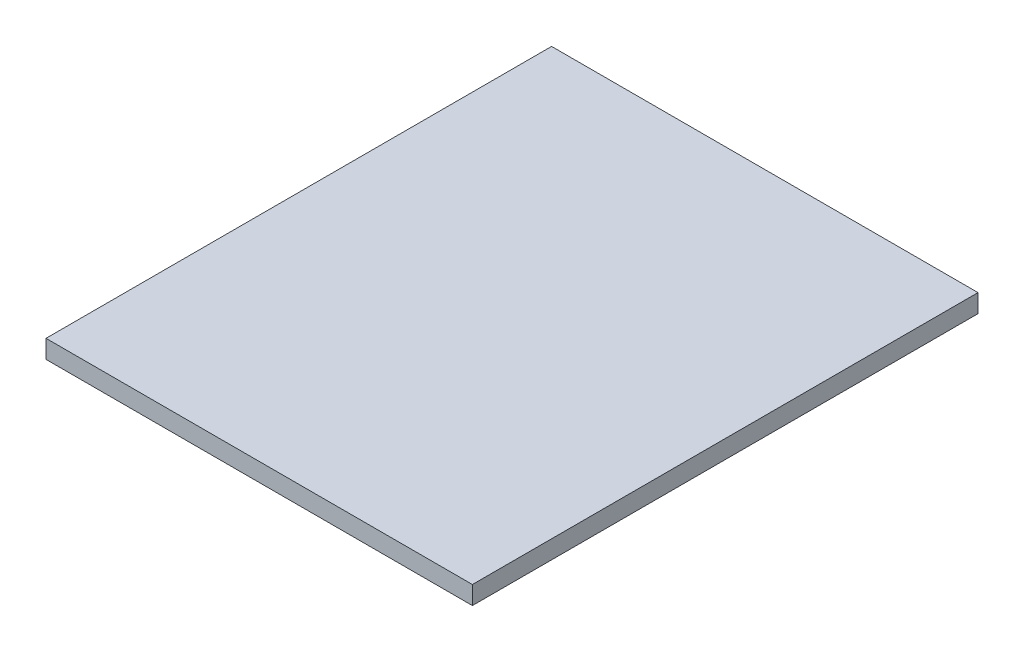
ISO-10303-21;
HEADER;
FILE_DESCRIPTION(('STEP AP214'),'2;1');
FILE_NAME('part.step','',(''),(''),'','','');
FILE_SCHEMA(('AUTOMOTIVE_DESIGN { 1 0 10303 214 1 1 1 1 }'));
ENDSEC;
DATA;
#1=APPLICATION_CONTEXT('core data for automotive mechanical design processes');
#2=APPLICATION_PROTOCOL_DEFINITION('international standard','automotive_design',2000,#1);
#3=PRODUCT_CONTEXT('',#1,'mechanical');
#4=PRODUCT('Part','Part','',(#3));
#5=PRODUCT_RELATED_PRODUCT_CATEGORY('part','',(#4));
#6=PRODUCT_DEFINITION_FORMATION('','',#4);
#7=PRODUCT_DEFINITION_CONTEXT('part definition',#1,'design');
#8=PRODUCT_DEFINITION('design','',#6,#7);
#9=PRODUCT_DEFINITION_SHAPE('','',#8);
#10=(LENGTH_UNIT() NAMED_UNIT(*) SI_UNIT(.MILLI.,.METRE.));
#11=(NAMED_UNIT(*) PLANE_ANGLE_UNIT() SI_UNIT($,.RADIAN.));
#12=(NAMED_UNIT(*) SI_UNIT($,.STERADIAN.) SOLID_ANGLE_UNIT());
#13=UNCERTAINTY_MEASURE_WITH_UNIT(LENGTH_MEASURE(1.E-05),#10,'distance_accuracy_value','');
#14=(GEOMETRIC_REPRESENTATION_CONTEXT(3) GLOBAL_UNCERTAINTY_ASSIGNED_CONTEXT((#13)) GLOBAL_UNIT_ASSIGNED_CONTEXT((#10,
#11,#12)) REPRESENTATION_CONTEXT('',''));
#15=CARTESIAN_POINT('',(0.,0.,0.));
#16=DIRECTION('',(0.,0.,1.));
#17=DIRECTION('',(1.,0.,0.));
#18=AXIS2_PLACEMENT_3D('',#15,#16,#17);
#19=CARTESIAN_POINT('',(-35.,3.,-41.5));
#20=DIRECTION('',(1.,0.,0.));
#21=DIRECTION('',(0.,0.,-1.));
#22=AXIS2_PLACEMENT_3D('',#19,#20,#21);
#23=PLANE('',#22);
#24=DIRECTION('',(0.,0.,1.));
#25=VECTOR('',#24,1.);
#26=CARTESIAN_POINT('',(-35.,0.,-41.5));
#27=LINE('',#26,#25);
#28=CARTESIAN_POINT('',(-35.,0.,-41.5));
#29=VERTEX_POINT('',#28);
#30=CARTESIAN_POINT('',(-35.,0.,41.5));
#31=VERTEX_POINT('',#30);
#32=EDGE_CURVE('E102',#29,#31,#27,.T.);
#33=ORIENTED_EDGE('',*,*,#32,.T.);
#34=DIRECTION('',(0.,-1.,0.));
#35=VECTOR('',#34,1.);
#36=CARTESIAN_POINT('',(-35.,3.,41.5));
#37=LINE('',#36,#35);
#38=CARTESIAN_POINT('',(-35.,3.,41.5));
#39=VERTEX_POINT('',#38);
#40=EDGE_CURVE('E11',#39,#31,#37,.T.);
#41=ORIENTED_EDGE('',*,*,#40,.F.);
#42=DIRECTION('',(0.,0.,1.));
#43=VECTOR('',#42,1.);
#44=CARTESIAN_POINT('',(-35.,3.,-41.5));
#45=LINE('',#44,#43);
#46=CARTESIAN_POINT('',(-35.,3.,-41.5));
#47=VERTEX_POINT('',#46);
#48=EDGE_CURVE('E90',#47,#39,#45,.T.);
#49=ORIENTED_EDGE('',*,*,#48,.F.);
#50=DIRECTION('',(0.,-1.,0.));
#51=VECTOR('',#50,1.);
#52=CARTESIAN_POINT('',(-35.,3.,-41.5));
#53=LINE('',#52,#51);
#54=EDGE_CURVE('E98',#47,#29,#53,.T.);
#55=ORIENTED_EDGE('',*,*,#54,.T.);
#56=EDGE_LOOP('',(#33,#41,#49,#55));
#57=FACE_BOUND('',#56,.T.);
#58=ADVANCED_FACE('F39',(#57),#23,.F.);
#59=CARTESIAN_POINT('',(35.,3.,41.5));
#60=DIRECTION('',(0.,0.,-1.));
#61=DIRECTION('',(-1.,0.,0.));
#62=AXIS2_PLACEMENT_3D('',#59,#60,#61);
#63=PLANE('',#62);
#64=DIRECTION('',(1.,0.,0.));
#65=VECTOR('',#64,1.);
#66=CARTESIAN_POINT('',(35.,0.,41.5));
#67=LINE('',#66,#65);
#68=CARTESIAN_POINT('',(35.,0.,41.5));
#69=VERTEX_POINT('',#68);
#70=EDGE_CURVE('E94',#31,#69,#67,.T.);
#71=ORIENTED_EDGE('',*,*,#70,.T.);
#72=DIRECTION('',(0.,-1.,0.));
#73=VECTOR('',#72,1.);
#74=CARTESIAN_POINT('',(35.,3.,41.5));
#75=LINE('',#74,#73);
#76=CARTESIAN_POINT('',(35.,3.,41.5));
#77=VERTEX_POINT('',#76);
#78=EDGE_CURVE('E47',#77,#69,#75,.T.);
#79=ORIENTED_EDGE('',*,*,#78,.F.);
#80=DIRECTION('',(1.,0.,0.));
#81=VECTOR('',#80,1.);
#82=CARTESIAN_POINT('',(35.,3.,41.5));
#83=LINE('',#82,#81);
#84=EDGE_CURVE('E85',#39,#77,#83,.T.);
#85=ORIENTED_EDGE('',*,*,#84,.F.);
#86=ORIENTED_EDGE('',*,*,#40,.T.);
#87=EDGE_LOOP('',(#71,#79,#85,#86));
#88=FACE_BOUND('',#87,.T.);
#89=ADVANCED_FACE('F93',(#88),#63,.F.);
#90=CARTESIAN_POINT('',(35.,3.,-41.5));
#91=DIRECTION('',(-1.,0.,0.));
#92=DIRECTION('',(0.,0.,1.));
#93=AXIS2_PLACEMENT_3D('',#90,#91,#92);
#94=PLANE('',#93);
#95=DIRECTION('',(0.,0.,-1.));
#96=VECTOR('',#95,1.);
#97=CARTESIAN_POINT('',(35.,0.,-41.5));
#98=LINE('',#97,#96);
#99=CARTESIAN_POINT('',(35.,0.,-41.5));
#100=VERTEX_POINT('',#99);
#101=EDGE_CURVE('E72',#69,#100,#98,.T.);
#102=ORIENTED_EDGE('',*,*,#101,.T.);
#103=DIRECTION('',(0.,-1.,0.));
#104=VECTOR('',#103,1.);
#105=CARTESIAN_POINT('',(35.,3.,-41.5));
#106=LINE('',#105,#104);
#107=CARTESIAN_POINT('',(35.,3.,-41.5));
#108=VERTEX_POINT('',#107);
#109=EDGE_CURVE('E95',#108,#100,#106,.T.);
#110=ORIENTED_EDGE('',*,*,#109,.F.);
#111=DIRECTION('',(0.,0.,-1.));
#112=VECTOR('',#111,1.);
#113=CARTESIAN_POINT('',(35.,3.,-41.5));
#114=LINE('',#113,#112);
#115=EDGE_CURVE('E88',#77,#108,#114,.T.);
#116=ORIENTED_EDGE('',*,*,#115,.F.);
#117=ORIENTED_EDGE('',*,*,#78,.T.);
#118=EDGE_LOOP('',(#102,#110,#116,#117));
#119=FACE_BOUND('',#118,.T.);
#120=ADVANCED_FACE('F96',(#119),#94,.F.);
#121=CARTESIAN_POINT('',(35.,3.,-41.5));
#122=DIRECTION('',(0.,0.,1.));
#123=DIRECTION('',(1.,0.,0.));
#124=AXIS2_PLACEMENT_3D('',#121,#122,#123);
#125=PLANE('',#124);
#126=DIRECTION('',(-1.,0.,0.));
#127=VECTOR('',#126,1.);
#128=CARTESIAN_POINT('',(35.,0.,-41.5));
#129=LINE('',#128,#127);
#130=EDGE_CURVE('E78',#100,#29,#129,.T.);
#131=ORIENTED_EDGE('',*,*,#130,.T.);
#132=ORIENTED_EDGE('',*,*,#54,.F.);
#133=DIRECTION('',(-1.,0.,0.));
#134=VECTOR('',#133,1.);
#135=CARTESIAN_POINT('',(35.,3.,-41.5));
#136=LINE('',#135,#134);
#137=EDGE_CURVE('E55',#108,#47,#136,.T.);
#138=ORIENTED_EDGE('',*,*,#137,.F.);
#139=ORIENTED_EDGE('',*,*,#109,.T.);
#140=EDGE_LOOP('',(#131,#132,#138,#139));
#141=FACE_BOUND('',#140,.T.);
#142=ADVANCED_FACE('F109',(#141),#125,.F.);
#143=CARTESIAN_POINT('',(0.,3.,0.));
#144=DIRECTION('',(0.,-1.,0.));
#145=DIRECTION('',(0.,0.,-1.));
#146=AXIS2_PLACEMENT_3D('',#143,#144,#145);
#147=PLANE('',#146);
#148=ORIENTED_EDGE('',*,*,#48,.T.);
#149=ORIENTED_EDGE('',*,*,#84,.T.);
#150=ORIENTED_EDGE('',*,*,#115,.T.);
#151=ORIENTED_EDGE('',*,*,#137,.T.);
#152=EDGE_LOOP('',(#148,#149,#150,#151));
#153=FACE_BOUND('',#152,.T.);
#154=ADVANCED_FACE('F86',(#153),#147,.F.);
#155=CARTESIAN_POINT('',(0.,0.,0.));
#156=DIRECTION('',(0.,-1.,0.));
#157=DIRECTION('',(0.,0.,-1.));
#158=AXIS2_PLACEMENT_3D('',#155,#156,#157);
#159=PLANE('',#158);
#160=ORIENTED_EDGE('',*,*,#32,.F.);
#161=ORIENTED_EDGE('',*,*,#130,.F.);
#162=ORIENTED_EDGE('',*,*,#101,.F.);
#163=ORIENTED_EDGE('',*,*,#70,.F.);
#164=EDGE_LOOP('',(#160,#161,#162,#163));
#165=FACE_BOUND('',#164,.T.);
#166=ADVANCED_FACE('F112',(#165),#159,.T.);
#167=CLOSED_SHELL('',(#58,#89,#120,#142,#154,#166));
#168=MANIFOLD_SOLID_BREP('B2',#167);
#169=ADVANCED_BREP_SHAPE_REPRESENTATION('',(#18,#168),#14);
#170=SHAPE_DEFINITION_REPRESENTATION(#9,#169);
ENDSEC;
END-ISO-10303-21;
